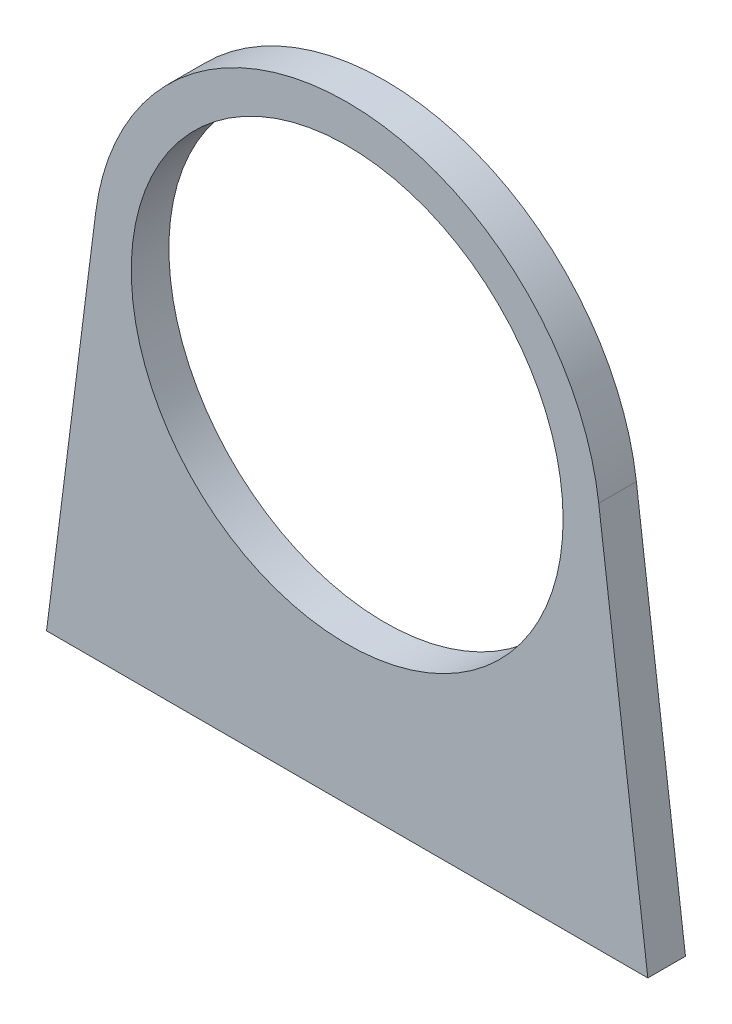
ISO-10303-21;
HEADER;
FILE_DESCRIPTION(('STEP AP214'),'2;1');
FILE_NAME('part.step','',(''),(''),'','','');
FILE_SCHEMA(('AUTOMOTIVE_DESIGN { 1 0 10303 214 1 1 1 1 }'));
ENDSEC;
DATA;
#1=APPLICATION_CONTEXT('core data for automotive mechanical design processes');
#2=APPLICATION_PROTOCOL_DEFINITION('international standard','automotive_design',2000,#1);
#3=PRODUCT_CONTEXT('',#1,'mechanical');
#4=PRODUCT('Part','Part','',(#3));
#5=PRODUCT_RELATED_PRODUCT_CATEGORY('part','',(#4));
#6=PRODUCT_DEFINITION_FORMATION('','',#4);
#7=PRODUCT_DEFINITION_CONTEXT('part definition',#1,'design');
#8=PRODUCT_DEFINITION('design','',#6,#7);
#9=PRODUCT_DEFINITION_SHAPE('','',#8);
#10=(LENGTH_UNIT() NAMED_UNIT(*) SI_UNIT(.MILLI.,.METRE.));
#11=(NAMED_UNIT(*) PLANE_ANGLE_UNIT() SI_UNIT($,.RADIAN.));
#12=(NAMED_UNIT(*) SI_UNIT($,.STERADIAN.) SOLID_ANGLE_UNIT());
#13=UNCERTAINTY_MEASURE_WITH_UNIT(LENGTH_MEASURE(1.E-05),#10,'distance_accuracy_value','');
#14=(GEOMETRIC_REPRESENTATION_CONTEXT(3) GLOBAL_UNCERTAINTY_ASSIGNED_CONTEXT((#13)) GLOBAL_UNIT_ASSIGNED_CONTEXT((#10,
#11,#12)) REPRESENTATION_CONTEXT('',''));
#15=CARTESIAN_POINT('',(0.,0.,0.));
#16=DIRECTION('',(0.,0.,1.));
#17=DIRECTION('',(1.,0.,0.));
#18=AXIS2_PLACEMENT_3D('',#15,#16,#17);
#19=CARTESIAN_POINT('',(0.,0.,2.54));
#20=DIRECTION('',(0.,0.,1.));
#21=DIRECTION('',(1.,0.,0.));
#22=AXIS2_PLACEMENT_3D('',#19,#20,#21);
#23=PLANE('',#22);
#24=CARTESIAN_POINT('',(0.,0.,2.54));
#25=DIRECTION('',(0.,0.,1.));
#26=DIRECTION('',(1.,0.,0.));
#27=AXIS2_PLACEMENT_3D('',#24,#25,#26);
#28=CIRCLE('',#27,17.1111690738146);
#29=CARTESIAN_POINT('',(16.9748428154301,2.15564803808784,2.54));
#30=VERTEX_POINT('',#29);
#31=CARTESIAN_POINT('',(-16.9748428154301,2.15564803808784,2.54));
#32=VERTEX_POINT('',#31);
#33=EDGE_CURVE('E91',#30,#32,#28,.T.);
#34=ORIENTED_EDGE('',*,*,#33,.T.);
#35=DIRECTION('',(-0.125979004052192,-0.992032907991473,0.));
#36=VECTOR('',#35,1.);
#37=CARTESIAN_POINT('',(-16.9748428154301,2.15564803808784,2.54));
#38=LINE('',#37,#36);
#39=CARTESIAN_POINT('',(-20.2875933643272,-23.930901742154,2.54));
#40=VERTEX_POINT('',#39);
#41=EDGE_CURVE('E86',#32,#40,#38,.T.);
#42=ORIENTED_EDGE('',*,*,#41,.T.);
#43=DIRECTION('',(1.,0.,0.));
#44=VECTOR('',#43,1.);
#45=CARTESIAN_POINT('',(-20.2875933643272,-23.930901742154,2.54));
#46=LINE('',#45,#44);
#47=CARTESIAN_POINT('',(20.2875933643272,-23.930901742154,2.54));
#48=VERTEX_POINT('',#47);
#49=EDGE_CURVE('E89',#40,#48,#46,.T.);
#50=ORIENTED_EDGE('',*,*,#49,.T.);
#51=DIRECTION('',(-0.125979004052193,0.992032907991473,0.));
#52=VECTOR('',#51,1.);
#53=CARTESIAN_POINT('',(16.9748428154301,2.15564803808784,2.54));
#54=LINE('',#53,#52);
#55=EDGE_CURVE('E56',#48,#30,#54,.T.);
#56=ORIENTED_EDGE('',*,*,#55,.T.);
#57=EDGE_LOOP('',(#34,#42,#50,#56));
#58=FACE_BOUND('',#57,.T.);
#59=CARTESIAN_POINT('',(0.,0.,2.54));
#60=DIRECTION('',(0.,0.,1.));
#61=DIRECTION('',(1.,0.,0.));
#62=AXIS2_PLACEMENT_3D('',#59,#60,#61);
#63=CIRCLE('',#62,14.5711690738146);
#64=CARTESIAN_POINT('',(14.5711690738146,0.,2.54));
#65=VERTEX_POINT('',#64);
#66=EDGE_CURVE('E106',#65,#65,#63,.T.);
#67=ORIENTED_EDGE('',*,*,#66,.F.);
#68=EDGE_LOOP('',(#67));
#69=FACE_BOUND('',#68,.T.);
#70=ADVANCED_FACE('F39',(#58,#69),#23,.T.);
#71=CARTESIAN_POINT('',(0.,0.,0.));
#72=DIRECTION('',(0.,0.,1.));
#73=DIRECTION('',(1.,0.,0.));
#74=AXIS2_PLACEMENT_3D('',#71,#72,#73);
#75=PLANE('',#74);
#76=CARTESIAN_POINT('',(0.,0.,0.));
#77=DIRECTION('',(0.,0.,1.));
#78=DIRECTION('',(1.,0.,0.));
#79=AXIS2_PLACEMENT_3D('',#76,#77,#78);
#80=CIRCLE('',#79,17.1111690738146);
#81=CARTESIAN_POINT('',(16.9748428154301,2.15564803808784,0.));
#82=VERTEX_POINT('',#81);
#83=CARTESIAN_POINT('',(-16.9748428154301,2.15564803808784,0.));
#84=VERTEX_POINT('',#83);
#85=EDGE_CURVE('E103',#82,#84,#80,.T.);
#86=ORIENTED_EDGE('',*,*,#85,.F.);
#87=DIRECTION('',(-0.125979004052193,0.992032907991473,0.));
#88=VECTOR('',#87,1.);
#89=CARTESIAN_POINT('',(16.9748428154301,2.15564803808784,0.));
#90=LINE('',#89,#88);
#91=CARTESIAN_POINT('',(20.2875933643272,-23.930901742154,0.));
#92=VERTEX_POINT('',#91);
#93=EDGE_CURVE('E79',#92,#82,#90,.T.);
#94=ORIENTED_EDGE('',*,*,#93,.F.);
#95=DIRECTION('',(1.,0.,0.));
#96=VECTOR('',#95,1.);
#97=CARTESIAN_POINT('',(-20.2875933643272,-23.930901742154,0.));
#98=LINE('',#97,#96);
#99=CARTESIAN_POINT('',(-20.2875933643272,-23.930901742154,0.));
#100=VERTEX_POINT('',#99);
#101=EDGE_CURVE('E73',#100,#92,#98,.T.);
#102=ORIENTED_EDGE('',*,*,#101,.F.);
#103=DIRECTION('',(-0.125979004052192,-0.992032907991473,0.));
#104=VECTOR('',#103,1.);
#105=CARTESIAN_POINT('',(-16.9748428154301,2.15564803808784,0.));
#106=LINE('',#105,#104);
#107=EDGE_CURVE('E95',#84,#100,#106,.T.);
#108=ORIENTED_EDGE('',*,*,#107,.F.);
#109=EDGE_LOOP('',(#86,#94,#102,#108));
#110=FACE_BOUND('',#109,.T.);
#111=CARTESIAN_POINT('',(0.,0.,0.));
#112=DIRECTION('',(0.,0.,1.));
#113=DIRECTION('',(1.,0.,0.));
#114=AXIS2_PLACEMENT_3D('',#111,#112,#113);
#115=CIRCLE('',#114,14.5711690738146);
#116=CARTESIAN_POINT('',(14.5711690738146,0.,0.));
#117=VERTEX_POINT('',#116);
#118=EDGE_CURVE('E118',#117,#117,#115,.T.);
#119=ORIENTED_EDGE('',*,*,#118,.T.);
#120=EDGE_LOOP('',(#119));
#121=FACE_BOUND('',#120,.T.);
#122=ADVANCED_FACE('F114',(#110,#121),#75,.F.);
#123=CARTESIAN_POINT('',(0.,0.,2.54));
#124=DIRECTION('',(0.,0.,-1.));
#125=DIRECTION('',(-1.,0.,0.));
#126=AXIS2_PLACEMENT_3D('',#123,#124,#125);
#127=CYLINDRICAL_SURFACE('',#126,17.1111690738146);
#128=ORIENTED_EDGE('',*,*,#85,.T.);
#129=DIRECTION('',(0.,0.,-1.));
#130=VECTOR('',#129,1.);
#131=CARTESIAN_POINT('',(-16.9748428154301,2.15564803808784,2.54));
#132=LINE('',#131,#130);
#133=EDGE_CURVE('E11',#32,#84,#132,.T.);
#134=ORIENTED_EDGE('',*,*,#133,.F.);
#135=ORIENTED_EDGE('',*,*,#33,.F.);
#136=DIRECTION('',(0.,0.,-1.));
#137=VECTOR('',#136,1.);
#138=CARTESIAN_POINT('',(16.9748428154301,2.15564803808784,2.54));
#139=LINE('',#138,#137);
#140=EDGE_CURVE('E99',#30,#82,#139,.T.);
#141=ORIENTED_EDGE('',*,*,#140,.T.);
#142=EDGE_LOOP('',(#128,#134,#135,#141));
#143=FACE_BOUND('',#142,.T.);
#144=ADVANCED_FACE('F41',(#143),#127,.T.);
#145=CARTESIAN_POINT('',(-16.9748428154301,2.15564803808784,2.54));
#146=DIRECTION('',(0.992032907991473,-0.125979004052192,0.));
#147=DIRECTION('',(0.125979004052192,0.992032907991473,0.));
#148=AXIS2_PLACEMENT_3D('',#145,#146,#147);
#149=PLANE('',#148);
#150=ORIENTED_EDGE('',*,*,#107,.T.);
#151=DIRECTION('',(0.,0.,-1.));
#152=VECTOR('',#151,1.);
#153=CARTESIAN_POINT('',(-20.2875933643272,-23.930901742154,2.54));
#154=LINE('',#153,#152);
#155=EDGE_CURVE('E48',#40,#100,#154,.T.);
#156=ORIENTED_EDGE('',*,*,#155,.F.);
#157=ORIENTED_EDGE('',*,*,#41,.F.);
#158=ORIENTED_EDGE('',*,*,#133,.T.);
#159=EDGE_LOOP('',(#150,#156,#157,#158));
#160=FACE_BOUND('',#159,.T.);
#161=ADVANCED_FACE('F94',(#160),#149,.F.);
#162=CARTESIAN_POINT('',(-20.2875933643272,-23.930901742154,2.54));
#163=DIRECTION('',(0.,1.,0.));
#164=DIRECTION('',(-1.,0.,0.));
#165=AXIS2_PLACEMENT_3D('',#162,#163,#164);
#166=PLANE('',#165);
#167=ORIENTED_EDGE('',*,*,#101,.T.);
#168=DIRECTION('',(0.,0.,-1.));
#169=VECTOR('',#168,1.);
#170=CARTESIAN_POINT('',(20.2875933643272,-23.930901742154,2.54));
#171=LINE('',#170,#169);
#172=EDGE_CURVE('E96',#48,#92,#171,.T.);
#173=ORIENTED_EDGE('',*,*,#172,.F.);
#174=ORIENTED_EDGE('',*,*,#49,.F.);
#175=ORIENTED_EDGE('',*,*,#155,.T.);
#176=EDGE_LOOP('',(#167,#173,#174,#175));
#177=FACE_BOUND('',#176,.T.);
#178=ADVANCED_FACE('F97',(#177),#166,.F.);
#179=CARTESIAN_POINT('',(16.9748428154301,2.15564803808784,2.54));
#180=DIRECTION('',(-0.992032907991473,-0.125979004052193,0.));
#181=DIRECTION('',(0.125979004052193,-0.992032907991473,0.));
#182=AXIS2_PLACEMENT_3D('',#179,#180,#181);
#183=PLANE('',#182);
#184=ORIENTED_EDGE('',*,*,#93,.T.);
#185=ORIENTED_EDGE('',*,*,#140,.F.);
#186=ORIENTED_EDGE('',*,*,#55,.F.);
#187=ORIENTED_EDGE('',*,*,#172,.T.);
#188=EDGE_LOOP('',(#184,#185,#186,#187));
#189=FACE_BOUND('',#188,.T.);
#190=ADVANCED_FACE('F111',(#189),#183,.F.);
#191=CARTESIAN_POINT('',(0.,0.,2.54));
#192=DIRECTION('',(0.,0.,-1.));
#193=DIRECTION('',(-1.,0.,0.));
#194=AXIS2_PLACEMENT_3D('',#191,#192,#193);
#195=CYLINDRICAL_SURFACE('',#194,14.5711690738146);
#196=ORIENTED_EDGE('',*,*,#66,.T.);
#197=EDGE_LOOP('',(#196));
#198=FACE_BOUND('',#197,.T.);
#199=ORIENTED_EDGE('',*,*,#118,.F.);
#200=EDGE_LOOP('',(#199));
#201=FACE_BOUND('',#200,.T.);
#202=ADVANCED_FACE('F124',(#198,#201),#195,.F.);
#203=CLOSED_SHELL('',(#70,#122,#144,#161,#178,#190,#202));
#204=MANIFOLD_SOLID_BREP('B2',#203);
#205=ADVANCED_BREP_SHAPE_REPRESENTATION('',(#18,#204),#14);
#206=SHAPE_DEFINITION_REPRESENTATION(#9,#205);
ENDSEC;
END-ISO-10303-21;
